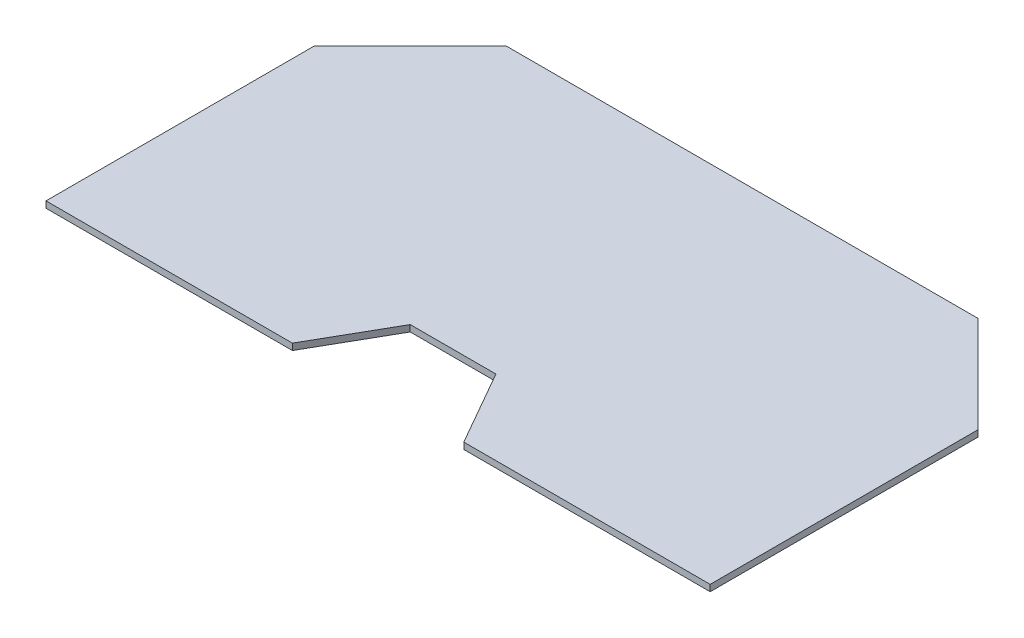
ISO-10303-21;
HEADER;
FILE_DESCRIPTION(('STEP AP214'),'2;1');
FILE_NAME('part.step','',(''),(''),'','','');
FILE_SCHEMA(('AUTOMOTIVE_DESIGN { 1 0 10303 214 1 1 1 1 }'));
ENDSEC;
DATA;
#1=APPLICATION_CONTEXT('core data for automotive mechanical design processes');
#2=APPLICATION_PROTOCOL_DEFINITION('international standard','automotive_design',2000,#1);
#3=PRODUCT_CONTEXT('',#1,'mechanical');
#4=PRODUCT('Part','Part','',(#3));
#5=PRODUCT_RELATED_PRODUCT_CATEGORY('part','',(#4));
#6=PRODUCT_DEFINITION_FORMATION('','',#4);
#7=PRODUCT_DEFINITION_CONTEXT('part definition',#1,'design');
#8=PRODUCT_DEFINITION('design','',#6,#7);
#9=PRODUCT_DEFINITION_SHAPE('','',#8);
#10=(LENGTH_UNIT() NAMED_UNIT(*) SI_UNIT(.MILLI.,.METRE.));
#11=(NAMED_UNIT(*) PLANE_ANGLE_UNIT() SI_UNIT($,.RADIAN.));
#12=(NAMED_UNIT(*) SI_UNIT($,.STERADIAN.) SOLID_ANGLE_UNIT());
#13=UNCERTAINTY_MEASURE_WITH_UNIT(LENGTH_MEASURE(1.E-05),#10,'distance_accuracy_value','');
#14=(GEOMETRIC_REPRESENTATION_CONTEXT(3) GLOBAL_UNCERTAINTY_ASSIGNED_CONTEXT((#13)) GLOBAL_UNIT_ASSIGNED_CONTEXT((#10,
#11,#12)) REPRESENTATION_CONTEXT('',''));
#15=CARTESIAN_POINT('',(0.,0.,0.));
#16=DIRECTION('',(0.,0.,1.));
#17=DIRECTION('',(1.,0.,0.));
#18=AXIS2_PLACEMENT_3D('',#15,#16,#17);
#19=CARTESIAN_POINT('',(-155.,3.,85.));
#20=DIRECTION('',(0.,0.,-1.));
#21=DIRECTION('',(-1.,0.,0.));
#22=AXIS2_PLACEMENT_3D('',#19,#20,#21);
#23=PLANE('',#22);
#24=DIRECTION('',(0.,-1.,0.));
#25=VECTOR('',#24,1.);
#26=CARTESIAN_POINT('',(-40.,448.707647857801,85.));
#27=LINE('',#26,#25);
#28=CARTESIAN_POINT('',(-40.,3.00000000000011,85.));
#29=VERTEX_POINT('',#28);
#30=CARTESIAN_POINT('',(-40.,1.11022302462516E-13,85.));
#31=VERTEX_POINT('',#30);
#32=EDGE_CURVE('E156',#29,#31,#27,.T.);
#33=ORIENTED_EDGE('',*,*,#32,.F.);
#34=DIRECTION('',(1.,0.,0.));
#35=VECTOR('',#34,1.);
#36=CARTESIAN_POINT('',(-155.,3.,85.));
#37=LINE('',#36,#35);
#38=CARTESIAN_POINT('',(-155.,3.,85.));
#39=VERTEX_POINT('',#38);
#40=EDGE_CURVE('E162',#39,#29,#37,.T.);
#41=ORIENTED_EDGE('',*,*,#40,.F.);
#42=DIRECTION('',(0.,-1.,0.));
#43=VECTOR('',#42,1.);
#44=CARTESIAN_POINT('',(-155.,3.,85.));
#45=LINE('',#44,#43);
#46=CARTESIAN_POINT('',(-155.,0.,85.));
#47=VERTEX_POINT('',#46);
#48=EDGE_CURVE('E192',#39,#47,#45,.T.);
#49=ORIENTED_EDGE('',*,*,#48,.T.);
#50=DIRECTION('',(1.,0.,0.));
#51=VECTOR('',#50,1.);
#52=CARTESIAN_POINT('',(-155.,0.,85.));
#53=LINE('',#52,#51);
#54=EDGE_CURVE('E185',#47,#31,#53,.T.);
#55=ORIENTED_EDGE('',*,*,#54,.T.);
#56=EDGE_LOOP('',(#33,#41,#49,#55));
#57=FACE_BOUND('',#56,.T.);
#58=ADVANCED_FACE('F40',(#57),#23,.F.);
#59=DIRECTION('',(0.,-1.,0.));
#60=VECTOR('',#59,1.);
#61=CARTESIAN_POINT('',(40.,448.707647857801,85.));
#62=LINE('',#61,#60);
#63=CARTESIAN_POINT('',(40.,3.00000000000011,85.));
#64=VERTEX_POINT('',#63);
#65=CARTESIAN_POINT('',(40.,1.11022302462516E-13,85.));
#66=VERTEX_POINT('',#65);
#67=EDGE_CURVE('E136',#64,#66,#62,.T.);
#68=ORIENTED_EDGE('',*,*,#67,.T.);
#69=CARTESIAN_POINT('',(155.,0.,85.));
#70=VERTEX_POINT('',#69);
#71=EDGE_CURVE('E184',#66,#70,#53,.T.);
#72=ORIENTED_EDGE('',*,*,#71,.T.);
#73=DIRECTION('',(0.,-1.,0.));
#74=VECTOR('',#73,1.);
#75=CARTESIAN_POINT('',(155.,3.,85.));
#76=LINE('',#75,#74);
#77=CARTESIAN_POINT('',(155.,3.,85.));
#78=VERTEX_POINT('',#77);
#79=EDGE_CURVE('E160',#78,#70,#76,.T.);
#80=ORIENTED_EDGE('',*,*,#79,.F.);
#81=EDGE_CURVE('E151',#64,#78,#37,.T.);
#82=ORIENTED_EDGE('',*,*,#81,.F.);
#83=EDGE_LOOP('',(#68,#72,#80,#82));
#84=FACE_BOUND('',#83,.T.);
#85=ADVANCED_FACE('F158',(#84),#23,.F.);
#86=CARTESIAN_POINT('',(0.,3.,0.));
#87=DIRECTION('',(0.,-1.,0.));
#88=DIRECTION('',(0.,0.,-1.));
#89=AXIS2_PLACEMENT_3D('',#86,#87,#88);
#90=PLANE('',#89);
#91=DIRECTION('',(0.,0.,-1.));
#92=VECTOR('',#91,1.);
#93=CARTESIAN_POINT('',(155.,3.,85.));
#94=LINE('',#93,#92);
#95=CARTESIAN_POINT('',(155.,3.,-39.9999999999998));
#96=VERTEX_POINT('',#95);
#97=EDGE_CURVE('E189',#78,#96,#94,.T.);
#98=ORIENTED_EDGE('',*,*,#97,.T.);
#99=DIRECTION('',(0.707106781186546,0.,0.707106781186549));
#100=VECTOR('',#99,1.);
#101=CARTESIAN_POINT('',(110.,3.,-85.));
#102=LINE('',#101,#100);
#103=CARTESIAN_POINT('',(110.,3.,-85.));
#104=VERTEX_POINT('',#103);
#105=EDGE_CURVE('E49',#96,#104,#102,.F.);
#106=ORIENTED_EDGE('',*,*,#105,.T.);
#107=DIRECTION('',(-1.,0.,0.));
#108=VECTOR('',#107,1.);
#109=CARTESIAN_POINT('',(-155.,3.,-85.));
#110=LINE('',#109,#108);
#111=CARTESIAN_POINT('',(-110.,3.,-85.));
#112=VERTEX_POINT('',#111);
#113=EDGE_CURVE('E169',#104,#112,#110,.T.);
#114=ORIENTED_EDGE('',*,*,#113,.T.);
#115=DIRECTION('',(0.707106781186549,0.,-0.707106781186546));
#116=VECTOR('',#115,1.);
#117=CARTESIAN_POINT('',(-155.,3.,-40.));
#118=LINE('',#117,#116);
#119=CARTESIAN_POINT('',(-155.,3.,-39.9999999999999));
#120=VERTEX_POINT('',#119);
#121=EDGE_CURVE('E59',#112,#120,#118,.F.);
#122=ORIENTED_EDGE('',*,*,#121,.T.);
#123=DIRECTION('',(0.,0.,1.));
#124=VECTOR('',#123,1.);
#125=CARTESIAN_POINT('',(-155.,3.,85.));
#126=LINE('',#125,#124);
#127=EDGE_CURVE('E163',#120,#39,#126,.T.);
#128=ORIENTED_EDGE('',*,*,#127,.T.);
#129=ORIENTED_EDGE('',*,*,#40,.T.);
#130=DIRECTION('',(-0.496138938356834,0.,0.868243142124459));
#131=VECTOR('',#130,1.);
#132=CARTESIAN_POINT('',(6.46153846153845,3.,3.69230769230769));
#133=LINE('',#132,#131);
#134=CARTESIAN_POINT('',(-20.,3.00000000000011,50.));
#135=VERTEX_POINT('',#134);
#136=EDGE_CURVE('E177',#135,#29,#133,.T.);
#137=ORIENTED_EDGE('',*,*,#136,.F.);
#138=DIRECTION('',(-1.,0.,0.));
#139=VECTOR('',#138,1.);
#140=CARTESIAN_POINT('',(0.,3.,50.));
#141=LINE('',#140,#139);
#142=CARTESIAN_POINT('',(20.,3.00000000000011,50.));
#143=VERTEX_POINT('',#142);
#144=EDGE_CURVE('E154',#143,#135,#141,.T.);
#145=ORIENTED_EDGE('',*,*,#144,.F.);
#146=DIRECTION('',(-0.496138938356834,0.,-0.868243142124459));
#147=VECTOR('',#146,1.);
#148=CARTESIAN_POINT('',(-6.46153846153846,3.,3.6923076923077));
#149=LINE('',#148,#147);
#150=EDGE_CURVE('E139',#64,#143,#149,.T.);
#151=ORIENTED_EDGE('',*,*,#150,.F.);
#152=ORIENTED_EDGE('',*,*,#81,.T.);
#153=EDGE_LOOP('',(#98,#106,#114,#122,#128,#129,#137,#145,#151,#152));
#154=FACE_BOUND('',#153,.T.);
#155=ADVANCED_FACE('F150',(#154),#90,.F.);
#156=CARTESIAN_POINT('',(0.,0.,0.));
#157=DIRECTION('',(0.,-1.,0.));
#158=DIRECTION('',(0.,0.,-1.));
#159=AXIS2_PLACEMENT_3D('',#156,#157,#158);
#160=PLANE('',#159);
#161=DIRECTION('',(-1.,0.,0.));
#162=VECTOR('',#161,1.);
#163=CARTESIAN_POINT('',(-155.,0.,-85.));
#164=LINE('',#163,#162);
#165=CARTESIAN_POINT('',(110.,0.,-85.));
#166=VERTEX_POINT('',#165);
#167=CARTESIAN_POINT('',(-110.,0.,-85.));
#168=VERTEX_POINT('',#167);
#169=EDGE_CURVE('E176',#166,#168,#164,.T.);
#170=ORIENTED_EDGE('',*,*,#169,.F.);
#171=DIRECTION('',(-0.707106781186546,0.,-0.707106781186549));
#172=VECTOR('',#171,1.);
#173=CARTESIAN_POINT('',(97.5000000000003,0.,-97.4999999999998));
#174=LINE('',#173,#172);
#175=CARTESIAN_POINT('',(155.,0.,-39.9999999999998));
#176=VERTEX_POINT('',#175);
#177=EDGE_CURVE('E215',#166,#176,#174,.F.);
#178=ORIENTED_EDGE('',*,*,#177,.T.);
#179=DIRECTION('',(0.,0.,-1.));
#180=VECTOR('',#179,1.);
#181=CARTESIAN_POINT('',(155.,0.,85.));
#182=LINE('',#181,#180);
#183=EDGE_CURVE('E173',#70,#176,#182,.T.);
#184=ORIENTED_EDGE('',*,*,#183,.F.);
#185=ORIENTED_EDGE('',*,*,#71,.F.);
#186=DIRECTION('',(-0.496138938356834,0.,-0.868243142124459));
#187=VECTOR('',#186,1.);
#188=CARTESIAN_POINT('',(-6.46153846153846,0.,3.6923076923077));
#189=LINE('',#188,#187);
#190=CARTESIAN_POINT('',(20.,0.,50.));
#191=VERTEX_POINT('',#190);
#192=EDGE_CURVE('E142',#66,#191,#189,.T.);
#193=ORIENTED_EDGE('',*,*,#192,.T.);
#194=DIRECTION('',(-1.,0.,0.));
#195=VECTOR('',#194,1.);
#196=CARTESIAN_POINT('',(0.,0.,50.));
#197=LINE('',#196,#195);
#198=CARTESIAN_POINT('',(-20.,1.11022302462516E-13,50.));
#199=VERTEX_POINT('',#198);
#200=EDGE_CURVE('E198',#191,#199,#197,.T.);
#201=ORIENTED_EDGE('',*,*,#200,.T.);
#202=DIRECTION('',(-0.496138938356834,0.,0.868243142124459));
#203=VECTOR('',#202,1.);
#204=CARTESIAN_POINT('',(6.46153846153845,0.,3.69230769230769));
#205=LINE('',#204,#203);
#206=EDGE_CURVE('E202',#199,#31,#205,.T.);
#207=ORIENTED_EDGE('',*,*,#206,.T.);
#208=ORIENTED_EDGE('',*,*,#54,.F.);
#209=DIRECTION('',(0.,0.,1.));
#210=VECTOR('',#209,1.);
#211=CARTESIAN_POINT('',(-155.,0.,85.));
#212=LINE('',#211,#210);
#213=CARTESIAN_POINT('',(-155.,0.,-39.9999999999999));
#214=VERTEX_POINT('',#213);
#215=EDGE_CURVE('E181',#214,#47,#212,.T.);
#216=ORIENTED_EDGE('',*,*,#215,.F.);
#217=DIRECTION('',(-0.707106781186549,0.,0.707106781186546));
#218=VECTOR('',#217,1.);
#219=CARTESIAN_POINT('',(-97.4999999999997,0.,-97.5000000000001));
#220=LINE('',#219,#218);
#221=EDGE_CURVE('E212',#214,#168,#220,.F.);
#222=ORIENTED_EDGE('',*,*,#221,.T.);
#223=EDGE_LOOP('',(#170,#178,#184,#185,#193,#201,#207,#208,#216,#222));
#224=FACE_BOUND('',#223,.T.);
#225=ADVANCED_FACE('F233',(#224),#160,.T.);
#226=CARTESIAN_POINT('',(155.,3.,85.));
#227=DIRECTION('',(-1.,0.,0.));
#228=DIRECTION('',(0.,0.,1.));
#229=AXIS2_PLACEMENT_3D('',#226,#227,#228);
#230=PLANE('',#229);
#231=ORIENTED_EDGE('',*,*,#183,.T.);
#232=DIRECTION('',(0.,1.,0.));
#233=VECTOR('',#232,1.);
#234=CARTESIAN_POINT('',(155.,3.,-39.9999999999998));
#235=LINE('',#234,#233);
#236=EDGE_CURVE('E67',#176,#96,#235,.T.);
#237=ORIENTED_EDGE('',*,*,#236,.T.);
#238=ORIENTED_EDGE('',*,*,#97,.F.);
#239=ORIENTED_EDGE('',*,*,#79,.T.);
#240=EDGE_LOOP('',(#231,#237,#238,#239));
#241=FACE_BOUND('',#240,.T.);
#242=ADVANCED_FACE('F234',(#241),#230,.F.);
#243=CARTESIAN_POINT('',(-155.,3.,-85.));
#244=DIRECTION('',(0.,0.,1.));
#245=DIRECTION('',(1.,0.,0.));
#246=AXIS2_PLACEMENT_3D('',#243,#244,#245);
#247=PLANE('',#246);
#248=ORIENTED_EDGE('',*,*,#113,.F.);
#249=DIRECTION('',(0.,-1.,0.));
#250=VECTOR('',#249,1.);
#251=CARTESIAN_POINT('',(110.,3.,-85.));
#252=LINE('',#251,#250);
#253=EDGE_CURVE('E208',#104,#166,#252,.T.);
#254=ORIENTED_EDGE('',*,*,#253,.T.);
#255=ORIENTED_EDGE('',*,*,#169,.T.);
#256=DIRECTION('',(0.,1.,0.));
#257=VECTOR('',#256,1.);
#258=CARTESIAN_POINT('',(-110.,3.,-85.));
#259=LINE('',#258,#257);
#260=EDGE_CURVE('E206',#168,#112,#259,.T.);
#261=ORIENTED_EDGE('',*,*,#260,.T.);
#262=EDGE_LOOP('',(#248,#254,#255,#261));
#263=FACE_BOUND('',#262,.T.);
#264=ADVANCED_FACE('F226',(#263),#247,.F.);
#265=CARTESIAN_POINT('',(-155.,3.,85.));
#266=DIRECTION('',(1.,0.,0.));
#267=DIRECTION('',(0.,0.,-1.));
#268=AXIS2_PLACEMENT_3D('',#265,#266,#267);
#269=PLANE('',#268);
#270=ORIENTED_EDGE('',*,*,#127,.F.);
#271=DIRECTION('',(0.,-1.,0.));
#272=VECTOR('',#271,1.);
#273=CARTESIAN_POINT('',(-155.,3.,-40.));
#274=LINE('',#273,#272);
#275=EDGE_CURVE('E11',#120,#214,#274,.T.);
#276=ORIENTED_EDGE('',*,*,#275,.T.);
#277=ORIENTED_EDGE('',*,*,#215,.T.);
#278=ORIENTED_EDGE('',*,*,#48,.F.);
#279=EDGE_LOOP('',(#270,#276,#277,#278));
#280=FACE_BOUND('',#279,.T.);
#281=ADVANCED_FACE('F261',(#280),#269,.F.);
#282=CARTESIAN_POINT('',(-40.,448.707647857801,85.));
#283=DIRECTION('',(0.868243142124459,0.,0.496138938356834));
#284=DIRECTION('',(0.496138938356834,0.,-0.868243142124459));
#285=AXIS2_PLACEMENT_3D('',#282,#283,#284);
#286=PLANE('',#285);
#287=DIRECTION('',(0.,-1.,0.));
#288=VECTOR('',#287,1.);
#289=CARTESIAN_POINT('',(-20.,448.707647857801,50.));
#290=LINE('',#289,#288);
#291=EDGE_CURVE('E244',#135,#199,#290,.T.);
#292=ORIENTED_EDGE('',*,*,#291,.F.);
#293=ORIENTED_EDGE('',*,*,#136,.T.);
#294=ORIENTED_EDGE('',*,*,#32,.T.);
#295=ORIENTED_EDGE('',*,*,#206,.F.);
#296=EDGE_LOOP('',(#292,#293,#294,#295));
#297=FACE_BOUND('',#296,.T.);
#298=ADVANCED_FACE('F278',(#297),#286,.T.);
#299=CARTESIAN_POINT('',(-20.,448.707647857801,50.));
#300=DIRECTION('',(0.,0.,1.));
#301=DIRECTION('',(1.,0.,0.));
#302=AXIS2_PLACEMENT_3D('',#299,#300,#301);
#303=PLANE('',#302);
#304=DIRECTION('',(0.,-1.,0.));
#305=VECTOR('',#304,1.);
#306=CARTESIAN_POINT('',(20.,448.707647857801,50.));
#307=LINE('',#306,#305);
#308=EDGE_CURVE('E147',#143,#191,#307,.T.);
#309=ORIENTED_EDGE('',*,*,#308,.F.);
#310=ORIENTED_EDGE('',*,*,#144,.T.);
#311=ORIENTED_EDGE('',*,*,#291,.T.);
#312=ORIENTED_EDGE('',*,*,#200,.F.);
#313=EDGE_LOOP('',(#309,#310,#311,#312));
#314=FACE_BOUND('',#313,.T.);
#315=ADVANCED_FACE('F251',(#314),#303,.T.);
#316=CARTESIAN_POINT('',(40.,448.707647857801,85.));
#317=DIRECTION('',(-0.868243142124459,0.,0.496138938356834));
#318=DIRECTION('',(0.496138938356834,0.,0.868243142124459));
#319=AXIS2_PLACEMENT_3D('',#316,#317,#318);
#320=PLANE('',#319);
#321=ORIENTED_EDGE('',*,*,#67,.F.);
#322=ORIENTED_EDGE('',*,*,#150,.T.);
#323=ORIENTED_EDGE('',*,*,#308,.T.);
#324=ORIENTED_EDGE('',*,*,#192,.F.);
#325=EDGE_LOOP('',(#321,#322,#323,#324));
#326=FACE_BOUND('',#325,.T.);
#327=ADVANCED_FACE('F138',(#326),#320,.T.);
#328=CARTESIAN_POINT('',(110.,3.,-85.));
#329=DIRECTION('',(-0.707106781186549,0.,0.707106781186546));
#330=DIRECTION('',(0.,-1.,0.));
#331=AXIS2_PLACEMENT_3D('',#328,#329,#330);
#332=PLANE('',#331);
#333=ORIENTED_EDGE('',*,*,#105,.F.);
#334=ORIENTED_EDGE('',*,*,#236,.F.);
#335=ORIENTED_EDGE('',*,*,#177,.F.);
#336=ORIENTED_EDGE('',*,*,#253,.F.);
#337=EDGE_LOOP('',(#333,#334,#335,#336));
#338=FACE_BOUND('',#337,.T.);
#339=ADVANCED_FACE('F230',(#338),#332,.F.);
#340=CARTESIAN_POINT('',(-155.,3.,-40.));
#341=DIRECTION('',(0.707106781186546,0.,0.707106781186549));
#342=DIRECTION('',(0.,-1.,0.));
#343=AXIS2_PLACEMENT_3D('',#340,#341,#342);
#344=PLANE('',#343);
#345=ORIENTED_EDGE('',*,*,#121,.F.);
#346=ORIENTED_EDGE('',*,*,#260,.F.);
#347=ORIENTED_EDGE('',*,*,#221,.F.);
#348=ORIENTED_EDGE('',*,*,#275,.F.);
#349=EDGE_LOOP('',(#345,#346,#347,#348));
#350=FACE_BOUND('',#349,.T.);
#351=ADVANCED_FACE('F42',(#350),#344,.F.);
#352=CLOSED_SHELL('',(#58,#85,#155,#225,#242,#264,#281,#298,#315,#327,#339,#351));
#353=MANIFOLD_SOLID_BREP('B2',#352);
#354=ADVANCED_BREP_SHAPE_REPRESENTATION('',(#18,#353),#14);
#355=SHAPE_DEFINITION_REPRESENTATION(#9,#354);
ENDSEC;
END-ISO-10303-21;
